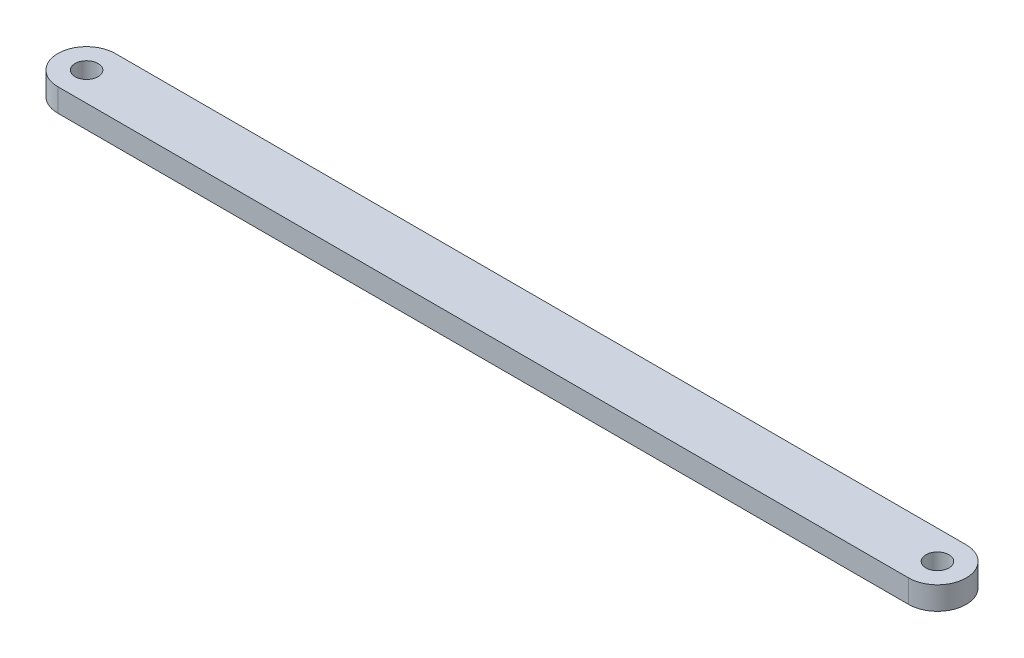
ISO-10303-21;
HEADER;
FILE_DESCRIPTION(('STEP AP214'),'2;1');
FILE_NAME('part.step','',(''),(''),'','','');
FILE_SCHEMA(('AUTOMOTIVE_DESIGN { 1 0 10303 214 1 1 1 1 }'));
ENDSEC;
DATA;
#1=APPLICATION_CONTEXT('core data for automotive mechanical design processes');
#2=APPLICATION_PROTOCOL_DEFINITION('international standard','automotive_design',2000,#1);
#3=PRODUCT_CONTEXT('',#1,'mechanical');
#4=PRODUCT('Part','Part','',(#3));
#5=PRODUCT_RELATED_PRODUCT_CATEGORY('part','',(#4));
#6=PRODUCT_DEFINITION_FORMATION('','',#4);
#7=PRODUCT_DEFINITION_CONTEXT('part definition',#1,'design');
#8=PRODUCT_DEFINITION('design','',#6,#7);
#9=PRODUCT_DEFINITION_SHAPE('','',#8);
#10=(LENGTH_UNIT() NAMED_UNIT(*) SI_UNIT(.MILLI.,.METRE.));
#11=(NAMED_UNIT(*) PLANE_ANGLE_UNIT() SI_UNIT($,.RADIAN.));
#12=(NAMED_UNIT(*) SI_UNIT($,.STERADIAN.) SOLID_ANGLE_UNIT());
#13=UNCERTAINTY_MEASURE_WITH_UNIT(LENGTH_MEASURE(1.E-05),#10,'distance_accuracy_value','');
#14=(GEOMETRIC_REPRESENTATION_CONTEXT(3) GLOBAL_UNCERTAINTY_ASSIGNED_CONTEXT((#13)) GLOBAL_UNIT_ASSIGNED_CONTEXT((#10,
#11,#12)) REPRESENTATION_CONTEXT('',''));
#15=CARTESIAN_POINT('',(0.,0.,0.));
#16=DIRECTION('',(0.,0.,1.));
#17=DIRECTION('',(1.,0.,0.));
#18=AXIS2_PLACEMENT_3D('',#15,#16,#17);
#19=CARTESIAN_POINT('',(0.,2.,2.5));
#20=DIRECTION('',(0.,-1.,0.));
#21=DIRECTION('',(0.,0.,-1.));
#22=AXIS2_PLACEMENT_3D('',#19,#20,#21);
#23=PLANE('',#22);
#24=CARTESIAN_POINT('',(0.,2.,2.5));
#25=DIRECTION('',(0.,1.,0.));
#26=DIRECTION('',(0.,0.,-1.));
#27=AXIS2_PLACEMENT_3D('',#24,#25,#26);
#28=CIRCLE('',#27,2.5);
#29=CARTESIAN_POINT('',(0.,2.,4.99999999999999));
#30=VERTEX_POINT('',#29);
#31=CARTESIAN_POINT('',(0.,2.,0.));
#32=VERTEX_POINT('',#31);
#33=EDGE_CURVE('E91',#30,#32,#28,.T.);
#34=ORIENTED_EDGE('',*,*,#33,.T.);
#35=DIRECTION('',(-1.,0.,0.));
#36=VECTOR('',#35,1.);
#37=CARTESIAN_POINT('',(0.,2.,0.));
#38=LINE('',#37,#36);
#39=CARTESIAN_POINT('',(-74.0000000000001,2.,0.));
#40=VERTEX_POINT('',#39);
#41=EDGE_CURVE('E86',#32,#40,#38,.T.);
#42=ORIENTED_EDGE('',*,*,#41,.T.);
#43=CARTESIAN_POINT('',(-74.0000000000001,2.,2.50000000000001));
#44=DIRECTION('',(0.,1.,0.));
#45=DIRECTION('',(0.,0.,1.));
#46=AXIS2_PLACEMENT_3D('',#43,#44,#45);
#47=CIRCLE('',#46,2.5);
#48=CARTESIAN_POINT('',(-74.0000000000001,2.,5.));
#49=VERTEX_POINT('',#48);
#50=EDGE_CURVE('E89',#40,#49,#47,.T.);
#51=ORIENTED_EDGE('',*,*,#50,.T.);
#52=DIRECTION('',(1.,0.,0.));
#53=VECTOR('',#52,1.);
#54=CARTESIAN_POINT('',(-74.0000000000001,2.,5.));
#55=LINE('',#54,#53);
#56=EDGE_CURVE('E56',#49,#30,#55,.T.);
#57=ORIENTED_EDGE('',*,*,#56,.T.);
#58=EDGE_LOOP('',(#34,#42,#51,#57));
#59=FACE_BOUND('',#58,.T.);
#60=CARTESIAN_POINT('',(-74.0000000000001,2.,2.50000000000001));
#61=DIRECTION('',(0.,1.,0.));
#62=DIRECTION('',(0.,0.,1.));
#63=AXIS2_PLACEMENT_3D('',#60,#61,#62);
#64=CIRCLE('',#63,0.999999999999998);
#65=CARTESIAN_POINT('',(-74.0000000000001,2.,3.5));
#66=VERTEX_POINT('',#65);
#67=EDGE_CURVE('E106',#66,#66,#64,.T.);
#68=ORIENTED_EDGE('',*,*,#67,.F.);
#69=EDGE_LOOP('',(#68));
#70=FACE_BOUND('',#69,.T.);
#71=CARTESIAN_POINT('',(0.,2.,2.5));
#72=DIRECTION('',(0.,1.,0.));
#73=DIRECTION('',(0.,0.,1.));
#74=AXIS2_PLACEMENT_3D('',#71,#72,#73);
#75=CIRCLE('',#74,1.);
#76=CARTESIAN_POINT('',(0.,2.,3.5));
#77=VERTEX_POINT('',#76);
#78=EDGE_CURVE('E121',#77,#77,#75,.T.);
#79=ORIENTED_EDGE('',*,*,#78,.F.);
#80=EDGE_LOOP('',(#79));
#81=FACE_BOUND('',#80,.T.);
#82=ADVANCED_FACE('F39',(#59,#70,#81),#23,.F.);
#83=CARTESIAN_POINT('',(0.,0.,2.5));
#84=DIRECTION('',(0.,-1.,0.));
#85=DIRECTION('',(0.,0.,-1.));
#86=AXIS2_PLACEMENT_3D('',#83,#84,#85);
#87=PLANE('',#86);
#88=CARTESIAN_POINT('',(-74.0000000000001,0.,2.50000000000001));
#89=DIRECTION('',(0.,1.,0.));
#90=DIRECTION('',(0.,0.,1.));
#91=AXIS2_PLACEMENT_3D('',#88,#89,#90);
#92=CIRCLE('',#91,0.999999999999998);
#93=CARTESIAN_POINT('',(-74.0000000000001,0.,3.5));
#94=VERTEX_POINT('',#93);
#95=EDGE_CURVE('E118',#94,#94,#92,.T.);
#96=ORIENTED_EDGE('',*,*,#95,.T.);
#97=EDGE_LOOP('',(#96));
#98=FACE_BOUND('',#97,.T.);
#99=CARTESIAN_POINT('',(0.,0.,2.5));
#100=DIRECTION('',(0.,1.,0.));
#101=DIRECTION('',(0.,0.,-1.));
#102=AXIS2_PLACEMENT_3D('',#99,#100,#101);
#103=CIRCLE('',#102,2.5);
#104=CARTESIAN_POINT('',(0.,0.,4.99999999999999));
#105=VERTEX_POINT('',#104);
#106=CARTESIAN_POINT('',(0.,0.,0.));
#107=VERTEX_POINT('',#106);
#108=EDGE_CURVE('E103',#105,#107,#103,.T.);
#109=ORIENTED_EDGE('',*,*,#108,.F.);
#110=DIRECTION('',(1.,0.,0.));
#111=VECTOR('',#110,1.);
#112=CARTESIAN_POINT('',(-74.0000000000001,0.,5.));
#113=LINE('',#112,#111);
#114=CARTESIAN_POINT('',(-74.0000000000001,0.,5.));
#115=VERTEX_POINT('',#114);
#116=EDGE_CURVE('E79',#115,#105,#113,.T.);
#117=ORIENTED_EDGE('',*,*,#116,.F.);
#118=CARTESIAN_POINT('',(-74.0000000000001,0.,2.50000000000001));
#119=DIRECTION('',(0.,1.,0.));
#120=DIRECTION('',(0.,0.,1.));
#121=AXIS2_PLACEMENT_3D('',#118,#119,#120);
#122=CIRCLE('',#121,2.5);
#123=CARTESIAN_POINT('',(-74.0000000000001,0.,0.));
#124=VERTEX_POINT('',#123);
#125=EDGE_CURVE('E73',#124,#115,#122,.T.);
#126=ORIENTED_EDGE('',*,*,#125,.F.);
#127=DIRECTION('',(-1.,0.,0.));
#128=VECTOR('',#127,1.);
#129=CARTESIAN_POINT('',(0.,0.,0.));
#130=LINE('',#129,#128);
#131=EDGE_CURVE('E95',#107,#124,#130,.T.);
#132=ORIENTED_EDGE('',*,*,#131,.F.);
#133=EDGE_LOOP('',(#109,#117,#126,#132));
#134=FACE_BOUND('',#133,.T.);
#135=CARTESIAN_POINT('',(0.,0.,2.5));
#136=DIRECTION('',(0.,1.,0.));
#137=DIRECTION('',(0.,0.,1.));
#138=AXIS2_PLACEMENT_3D('',#135,#136,#137);
#139=CIRCLE('',#138,1.);
#140=CARTESIAN_POINT('',(0.,0.,3.5));
#141=VERTEX_POINT('',#140);
#142=EDGE_CURVE('E124',#141,#141,#139,.T.);
#143=ORIENTED_EDGE('',*,*,#142,.T.);
#144=EDGE_LOOP('',(#143));
#145=FACE_BOUND('',#144,.T.);
#146=ADVANCED_FACE('F114',(#98,#134,#145),#87,.T.);
#147=CARTESIAN_POINT('',(0.,2.,2.5));
#148=DIRECTION('',(0.,-1.,0.));
#149=DIRECTION('',(0.,0.,-1.));
#150=AXIS2_PLACEMENT_3D('',#147,#148,#149);
#151=CYLINDRICAL_SURFACE('',#150,2.5);
#152=ORIENTED_EDGE('',*,*,#108,.T.);
#153=DIRECTION('',(0.,-1.,0.));
#154=VECTOR('',#153,1.);
#155=CARTESIAN_POINT('',(0.,2.,0.));
#156=LINE('',#155,#154);
#157=EDGE_CURVE('E11',#32,#107,#156,.T.);
#158=ORIENTED_EDGE('',*,*,#157,.F.);
#159=ORIENTED_EDGE('',*,*,#33,.F.);
#160=DIRECTION('',(0.,-1.,0.));
#161=VECTOR('',#160,1.);
#162=CARTESIAN_POINT('',(0.,2.,4.99999999999999));
#163=LINE('',#162,#161);
#164=EDGE_CURVE('E99',#30,#105,#163,.T.);
#165=ORIENTED_EDGE('',*,*,#164,.T.);
#166=EDGE_LOOP('',(#152,#158,#159,#165));
#167=FACE_BOUND('',#166,.T.);
#168=ADVANCED_FACE('F41',(#167),#151,.T.);
#169=CARTESIAN_POINT('',(0.,2.,0.));
#170=DIRECTION('',(0.,0.,1.));
#171=DIRECTION('',(1.,0.,0.));
#172=AXIS2_PLACEMENT_3D('',#169,#170,#171);
#173=PLANE('',#172);
#174=ORIENTED_EDGE('',*,*,#131,.T.);
#175=DIRECTION('',(0.,-1.,0.));
#176=VECTOR('',#175,1.);
#177=CARTESIAN_POINT('',(-74.0000000000001,2.,0.));
#178=LINE('',#177,#176);
#179=EDGE_CURVE('E48',#40,#124,#178,.T.);
#180=ORIENTED_EDGE('',*,*,#179,.F.);
#181=ORIENTED_EDGE('',*,*,#41,.F.);
#182=ORIENTED_EDGE('',*,*,#157,.T.);
#183=EDGE_LOOP('',(#174,#180,#181,#182));
#184=FACE_BOUND('',#183,.T.);
#185=ADVANCED_FACE('F94',(#184),#173,.F.);
#186=CARTESIAN_POINT('',(-74.0000000000001,2.,2.50000000000001));
#187=DIRECTION('',(0.,-1.,0.));
#188=DIRECTION('',(0.,0.,-1.));
#189=AXIS2_PLACEMENT_3D('',#186,#187,#188);
#190=CYLINDRICAL_SURFACE('',#189,2.5);
#191=ORIENTED_EDGE('',*,*,#125,.T.);
#192=DIRECTION('',(0.,-1.,0.));
#193=VECTOR('',#192,1.);
#194=CARTESIAN_POINT('',(-74.0000000000001,2.,5.));
#195=LINE('',#194,#193);
#196=EDGE_CURVE('E96',#49,#115,#195,.T.);
#197=ORIENTED_EDGE('',*,*,#196,.F.);
#198=ORIENTED_EDGE('',*,*,#50,.F.);
#199=ORIENTED_EDGE('',*,*,#179,.T.);
#200=EDGE_LOOP('',(#191,#197,#198,#199));
#201=FACE_BOUND('',#200,.T.);
#202=ADVANCED_FACE('F97',(#201),#190,.T.);
#203=CARTESIAN_POINT('',(-74.0000000000001,2.,5.));
#204=DIRECTION('',(0.,0.,-1.));
#205=DIRECTION('',(-1.,0.,0.));
#206=AXIS2_PLACEMENT_3D('',#203,#204,#205);
#207=PLANE('',#206);
#208=ORIENTED_EDGE('',*,*,#116,.T.);
#209=ORIENTED_EDGE('',*,*,#164,.F.);
#210=ORIENTED_EDGE('',*,*,#56,.F.);
#211=ORIENTED_EDGE('',*,*,#196,.T.);
#212=EDGE_LOOP('',(#208,#209,#210,#211));
#213=FACE_BOUND('',#212,.T.);
#214=ADVANCED_FACE('F111',(#213),#207,.F.);
#215=CARTESIAN_POINT('',(-74.0000000000001,2.,2.50000000000001));
#216=DIRECTION('',(0.,-1.,0.));
#217=DIRECTION('',(0.,0.,-1.));
#218=AXIS2_PLACEMENT_3D('',#215,#216,#217);
#219=CYLINDRICAL_SURFACE('',#218,0.999999999999998);
#220=ORIENTED_EDGE('',*,*,#67,.T.);
#221=EDGE_LOOP('',(#220));
#222=FACE_BOUND('',#221,.T.);
#223=ORIENTED_EDGE('',*,*,#95,.F.);
#224=EDGE_LOOP('',(#223));
#225=FACE_BOUND('',#224,.T.);
#226=ADVANCED_FACE('F141',(#222,#225),#219,.F.);
#227=CARTESIAN_POINT('',(0.,2.,2.5));
#228=DIRECTION('',(0.,-1.,0.));
#229=DIRECTION('',(0.,0.,-1.));
#230=AXIS2_PLACEMENT_3D('',#227,#228,#229);
#231=CYLINDRICAL_SURFACE('',#230,1.);
#232=ORIENTED_EDGE('',*,*,#78,.T.);
#233=EDGE_LOOP('',(#232));
#234=FACE_BOUND('',#233,.T.);
#235=ORIENTED_EDGE('',*,*,#142,.F.);
#236=EDGE_LOOP('',(#235));
#237=FACE_BOUND('',#236,.T.);
#238=ADVANCED_FACE('F130',(#234,#237),#231,.F.);
#239=CLOSED_SHELL('',(#82,#146,#168,#185,#202,#214,#226,#238));
#240=MANIFOLD_SOLID_BREP('B2',#239);
#241=ADVANCED_BREP_SHAPE_REPRESENTATION('',(#18,#240),#14);
#242=SHAPE_DEFINITION_REPRESENTATION(#9,#241);
ENDSEC;
END-ISO-10303-21;
